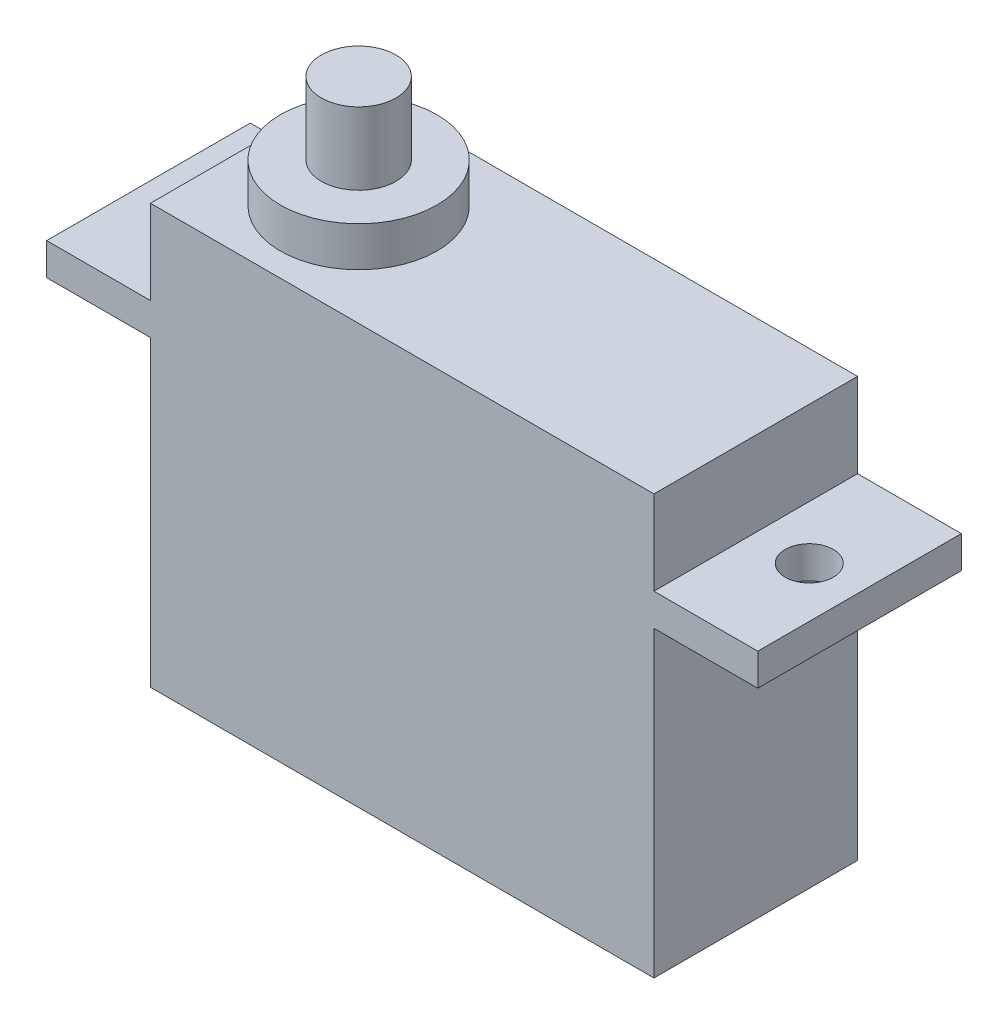
ISO-10303-21;
HEADER;
FILE_DESCRIPTION(('STEP AP214'),'2;1');
FILE_NAME('part.step','',(''),(''),'','','');
FILE_SCHEMA(('AUTOMOTIVE_DESIGN { 1 0 10303 214 1 1 1 1 }'));
ENDSEC;
DATA;
#1=APPLICATION_CONTEXT('core data for automotive mechanical design processes');
#2=APPLICATION_PROTOCOL_DEFINITION('international standard','automotive_design',2000,#1);
#3=PRODUCT_CONTEXT('',#1,'mechanical');
#4=PRODUCT('Part','Part','',(#3));
#5=PRODUCT_RELATED_PRODUCT_CATEGORY('part','',(#4));
#6=PRODUCT_DEFINITION_FORMATION('','',#4);
#7=PRODUCT_DEFINITION_CONTEXT('part definition',#1,'design');
#8=PRODUCT_DEFINITION('design','',#6,#7);
#9=PRODUCT_DEFINITION_SHAPE('','',#8);
#10=(LENGTH_UNIT() NAMED_UNIT(*) SI_UNIT(.MILLI.,.METRE.));
#11=(NAMED_UNIT(*) PLANE_ANGLE_UNIT() SI_UNIT($,.RADIAN.));
#12=(NAMED_UNIT(*) SI_UNIT($,.STERADIAN.) SOLID_ANGLE_UNIT());
#13=UNCERTAINTY_MEASURE_WITH_UNIT(LENGTH_MEASURE(1.E-05),#10,'distance_accuracy_value','');
#14=(GEOMETRIC_REPRESENTATION_CONTEXT(3) GLOBAL_UNCERTAINTY_ASSIGNED_CONTEXT((#13)) GLOBAL_UNIT_ASSIGNED_CONTEXT((#10,
#11,#12)) REPRESENTATION_CONTEXT('',''));
#15=CARTESIAN_POINT('',(0.,0.,0.));
#16=DIRECTION('',(0.,0.,1.));
#17=DIRECTION('',(1.,0.,0.));
#18=AXIS2_PLACEMENT_3D('',#15,#16,#17);
#19=CARTESIAN_POINT('',(-3.88,0.,7.61));
#20=DIRECTION('',(0.,1.,0.));
#21=DIRECTION('',(0.,0.,1.));
#22=AXIS2_PLACEMENT_3D('',#19,#20,#21);
#23=PLANE('',#22);
#24=CARTESIAN_POINT('',(-2.,0.,3.805));
#25=DIRECTION('',(0.,1.,0.));
#26=DIRECTION('',(0.,0.,1.));
#27=AXIS2_PLACEMENT_3D('',#24,#25,#26);
#28=CIRCLE('',#27,0.9);
#29=CARTESIAN_POINT('',(-2.9,0.,3.805));
#30=VERTEX_POINT('',#29);
#31=EDGE_CURVE('E271',#30,#30,#28,.F.);
#32=ORIENTED_EDGE('',*,*,#31,.F.);
#33=EDGE_LOOP('',(#32));
#34=FACE_BOUND('',#33,.T.);
#35=DIRECTION('',(1.,0.,0.));
#36=VECTOR('',#35,1.);
#37=CARTESIAN_POINT('',(-3.88,0.,0.));
#38=LINE('',#37,#36);
#39=CARTESIAN_POINT('',(-3.88,0.,0.));
#40=VERTEX_POINT('',#39);
#41=CARTESIAN_POINT('',(0.,0.,0.));
#42=VERTEX_POINT('',#41);
#43=EDGE_CURVE('E154',#40,#42,#38,.T.);
#44=ORIENTED_EDGE('',*,*,#43,.T.);
#45=DIRECTION('',(0.,0.,-1.));
#46=VECTOR('',#45,1.);
#47=CARTESIAN_POINT('',(0.,0.,7.61));
#48=LINE('',#47,#46);
#49=CARTESIAN_POINT('',(0.,0.,7.61));
#50=VERTEX_POINT('',#49);
#51=EDGE_CURVE('E41',#50,#42,#48,.T.);
#52=ORIENTED_EDGE('',*,*,#51,.F.);
#53=DIRECTION('',(1.,0.,0.));
#54=VECTOR('',#53,1.);
#55=CARTESIAN_POINT('',(-3.88,0.,7.61));
#56=LINE('',#55,#54);
#57=CARTESIAN_POINT('',(-3.88,0.,7.61));
#58=VERTEX_POINT('',#57);
#59=EDGE_CURVE('E177',#58,#50,#56,.T.);
#60=ORIENTED_EDGE('',*,*,#59,.F.);
#61=DIRECTION('',(0.,0.,-1.));
#62=VECTOR('',#61,1.);
#63=CARTESIAN_POINT('',(-3.88,0.,7.61));
#64=LINE('',#63,#62);
#65=EDGE_CURVE('E150',#58,#40,#64,.T.);
#66=ORIENTED_EDGE('',*,*,#65,.T.);
#67=EDGE_LOOP('',(#44,#52,#60,#66));
#68=FACE_BOUND('',#67,.T.);
#69=ADVANCED_FACE('F33',(#34,#68),#23,.F.);
#70=CARTESIAN_POINT('',(0.,0.,7.61));
#71=DIRECTION('',(1.,0.,0.));
#72=DIRECTION('',(0.,1.,0.));
#73=AXIS2_PLACEMENT_3D('',#70,#71,#72);
#74=PLANE('',#73);
#75=DIRECTION('',(0.,-1.,0.));
#76=VECTOR('',#75,1.);
#77=CARTESIAN_POINT('',(0.,0.,0.));
#78=LINE('',#77,#76);
#79=CARTESIAN_POINT('',(0.,-11.32,0.));
#80=VERTEX_POINT('',#79);
#81=EDGE_CURVE('E157',#42,#80,#78,.T.);
#82=ORIENTED_EDGE('',*,*,#81,.T.);
#83=DIRECTION('',(0.,0.,-1.));
#84=VECTOR('',#83,1.);
#85=CARTESIAN_POINT('',(0.,-11.32,7.61));
#86=LINE('',#85,#84);
#87=CARTESIAN_POINT('',(0.,-11.32,7.61));
#88=VERTEX_POINT('',#87);
#89=EDGE_CURVE('E199',#88,#80,#86,.T.);
#90=ORIENTED_EDGE('',*,*,#89,.F.);
#91=DIRECTION('',(0.,-1.,0.));
#92=VECTOR('',#91,1.);
#93=CARTESIAN_POINT('',(0.,0.,7.61));
#94=LINE('',#93,#92);
#95=EDGE_CURVE('E105',#50,#88,#94,.T.);
#96=ORIENTED_EDGE('',*,*,#95,.F.);
#97=ORIENTED_EDGE('',*,*,#51,.T.);
#98=EDGE_LOOP('',(#82,#90,#96,#97));
#99=FACE_BOUND('',#98,.T.);
#100=ADVANCED_FACE('F202',(#99),#74,.F.);
#101=CARTESIAN_POINT('',(0.,-11.32,7.61));
#102=DIRECTION('',(0.,1.,0.));
#103=DIRECTION('',(0.,0.,1.));
#104=AXIS2_PLACEMENT_3D('',#101,#102,#103);
#105=PLANE('',#104);
#106=DIRECTION('',(1.,0.,0.));
#107=VECTOR('',#106,1.);
#108=CARTESIAN_POINT('',(0.,-11.32,0.));
#109=LINE('',#108,#107);
#110=CARTESIAN_POINT('',(18.82,-11.32,0.));
#111=VERTEX_POINT('',#110);
#112=EDGE_CURVE('E160',#80,#111,#109,.T.);
#113=ORIENTED_EDGE('',*,*,#112,.T.);
#114=DIRECTION('',(0.,0.,-1.));
#115=VECTOR('',#114,1.);
#116=CARTESIAN_POINT('',(18.82,-11.32,7.61));
#117=LINE('',#116,#115);
#118=CARTESIAN_POINT('',(18.82,-11.32,7.61));
#119=VERTEX_POINT('',#118);
#120=EDGE_CURVE('E196',#119,#111,#117,.T.);
#121=ORIENTED_EDGE('',*,*,#120,.F.);
#122=DIRECTION('',(1.,0.,0.));
#123=VECTOR('',#122,1.);
#124=CARTESIAN_POINT('',(0.,-11.32,7.61));
#125=LINE('',#124,#123);
#126=EDGE_CURVE('E222',#88,#119,#125,.T.);
#127=ORIENTED_EDGE('',*,*,#126,.F.);
#128=ORIENTED_EDGE('',*,*,#89,.T.);
#129=EDGE_LOOP('',(#113,#121,#127,#128));
#130=FACE_BOUND('',#129,.T.);
#131=ADVANCED_FACE('F213',(#130),#105,.F.);
#132=CARTESIAN_POINT('',(18.82,-11.32,7.61));
#133=DIRECTION('',(-1.,0.,0.));
#134=DIRECTION('',(0.,0.,1.));
#135=AXIS2_PLACEMENT_3D('',#132,#133,#134);
#136=PLANE('',#135);
#137=DIRECTION('',(0.,1.,0.));
#138=VECTOR('',#137,1.);
#139=CARTESIAN_POINT('',(18.82,-11.32,0.));
#140=LINE('',#139,#138);
#141=CARTESIAN_POINT('',(18.82,0.,0.));
#142=VERTEX_POINT('',#141);
#143=EDGE_CURVE('E162',#111,#142,#140,.T.);
#144=ORIENTED_EDGE('',*,*,#143,.T.);
#145=DIRECTION('',(0.,0.,-1.));
#146=VECTOR('',#145,1.);
#147=CARTESIAN_POINT('',(18.82,0.,7.61));
#148=LINE('',#147,#146);
#149=CARTESIAN_POINT('',(18.82,0.,7.61));
#150=VERTEX_POINT('',#149);
#151=EDGE_CURVE('E193',#150,#142,#148,.T.);
#152=ORIENTED_EDGE('',*,*,#151,.F.);
#153=DIRECTION('',(0.,1.,0.));
#154=VECTOR('',#153,1.);
#155=CARTESIAN_POINT('',(18.82,-11.32,7.61));
#156=LINE('',#155,#154);
#157=EDGE_CURVE('E219',#119,#150,#156,.T.);
#158=ORIENTED_EDGE('',*,*,#157,.F.);
#159=ORIENTED_EDGE('',*,*,#120,.T.);
#160=EDGE_LOOP('',(#144,#152,#158,#159));
#161=FACE_BOUND('',#160,.T.);
#162=ADVANCED_FACE('F217',(#161),#136,.F.);
#163=CARTESIAN_POINT('',(18.82,0.,7.61));
#164=DIRECTION('',(0.,1.,0.));
#165=DIRECTION('',(0.,0.,1.));
#166=AXIS2_PLACEMENT_3D('',#163,#164,#165);
#167=PLANE('',#166);
#168=CARTESIAN_POINT('',(20.82,0.,3.805));
#169=DIRECTION('',(0.,1.,0.));
#170=DIRECTION('',(0.,0.,1.));
#171=AXIS2_PLACEMENT_3D('',#168,#169,#170);
#172=CIRCLE('',#171,0.9);
#173=CARTESIAN_POINT('',(19.92,0.,3.805));
#174=VERTEX_POINT('',#173);
#175=EDGE_CURVE('E158',#174,#174,#172,.F.);
#176=ORIENTED_EDGE('',*,*,#175,.F.);
#177=EDGE_LOOP('',(#176));
#178=FACE_BOUND('',#177,.T.);
#179=DIRECTION('',(1.,0.,0.));
#180=VECTOR('',#179,1.);
#181=CARTESIAN_POINT('',(18.82,0.,0.));
#182=LINE('',#181,#180);
#183=CARTESIAN_POINT('',(22.7,0.,0.));
#184=VERTEX_POINT('',#183);
#185=EDGE_CURVE('E164',#142,#184,#182,.T.);
#186=ORIENTED_EDGE('',*,*,#185,.T.);
#187=DIRECTION('',(0.,0.,-1.));
#188=VECTOR('',#187,1.);
#189=CARTESIAN_POINT('',(22.7,0.,7.61));
#190=LINE('',#189,#188);
#191=CARTESIAN_POINT('',(22.7,0.,7.61));
#192=VERTEX_POINT('',#191);
#193=EDGE_CURVE('E190',#192,#184,#190,.T.);
#194=ORIENTED_EDGE('',*,*,#193,.F.);
#195=DIRECTION('',(1.,0.,0.));
#196=VECTOR('',#195,1.);
#197=CARTESIAN_POINT('',(18.82,0.,7.61));
#198=LINE('',#197,#196);
#199=EDGE_CURVE('E221',#150,#192,#198,.T.);
#200=ORIENTED_EDGE('',*,*,#199,.F.);
#201=ORIENTED_EDGE('',*,*,#151,.T.);
#202=EDGE_LOOP('',(#186,#194,#200,#201));
#203=FACE_BOUND('',#202,.T.);
#204=ADVANCED_FACE('F253',(#178,#203),#167,.F.);
#205=CARTESIAN_POINT('',(22.7,0.,7.61));
#206=DIRECTION('',(-1.,0.,0.));
#207=DIRECTION('',(0.,0.,1.));
#208=AXIS2_PLACEMENT_3D('',#205,#206,#207);
#209=PLANE('',#208);
#210=DIRECTION('',(0.,1.,0.));
#211=VECTOR('',#210,1.);
#212=CARTESIAN_POINT('',(22.7,0.,0.));
#213=LINE('',#212,#211);
#214=CARTESIAN_POINT('',(22.7,1.2,0.));
#215=VERTEX_POINT('',#214);
#216=EDGE_CURVE('E166',#184,#215,#213,.T.);
#217=ORIENTED_EDGE('',*,*,#216,.T.);
#218=DIRECTION('',(0.,0.,-1.));
#219=VECTOR('',#218,1.);
#220=CARTESIAN_POINT('',(22.7,1.2,7.61));
#221=LINE('',#220,#219);
#222=CARTESIAN_POINT('',(22.7,1.2,7.61));
#223=VERTEX_POINT('',#222);
#224=EDGE_CURVE('E187',#223,#215,#221,.T.);
#225=ORIENTED_EDGE('',*,*,#224,.F.);
#226=DIRECTION('',(0.,1.,0.));
#227=VECTOR('',#226,1.);
#228=CARTESIAN_POINT('',(22.7,0.,7.61));
#229=LINE('',#228,#227);
#230=EDGE_CURVE('E224',#192,#223,#229,.T.);
#231=ORIENTED_EDGE('',*,*,#230,.F.);
#232=ORIENTED_EDGE('',*,*,#193,.T.);
#233=EDGE_LOOP('',(#217,#225,#231,#232));
#234=FACE_BOUND('',#233,.T.);
#235=ADVANCED_FACE('F250',(#234),#209,.F.);
#236=CARTESIAN_POINT('',(22.7,1.2,7.61));
#237=DIRECTION('',(0.,-1.,0.));
#238=DIRECTION('',(1.,0.,0.));
#239=AXIS2_PLACEMENT_3D('',#236,#237,#238);
#240=PLANE('',#239);
#241=CARTESIAN_POINT('',(20.82,1.2,3.805));
#242=DIRECTION('',(0.,1.,0.));
#243=DIRECTION('',(-1.,0.,0.));
#244=AXIS2_PLACEMENT_3D('',#241,#242,#243);
#245=CIRCLE('',#244,0.9);
#246=CARTESIAN_POINT('',(19.92,1.2,3.805));
#247=VERTEX_POINT('',#246);
#248=EDGE_CURVE('E273',#247,#247,#245,.T.);
#249=ORIENTED_EDGE('',*,*,#248,.F.);
#250=EDGE_LOOP('',(#249));
#251=FACE_BOUND('',#250,.T.);
#252=DIRECTION('',(-1.,0.,0.));
#253=VECTOR('',#252,1.);
#254=CARTESIAN_POINT('',(22.7,1.2,0.));
#255=LINE('',#254,#253);
#256=CARTESIAN_POINT('',(18.82,1.2,0.));
#257=VERTEX_POINT('',#256);
#258=EDGE_CURVE('E168',#215,#257,#255,.T.);
#259=ORIENTED_EDGE('',*,*,#258,.T.);
#260=DIRECTION('',(0.,0.,-1.));
#261=VECTOR('',#260,1.);
#262=CARTESIAN_POINT('',(18.82,1.2,7.61));
#263=LINE('',#262,#261);
#264=CARTESIAN_POINT('',(18.82,1.2,7.61));
#265=VERTEX_POINT('',#264);
#266=EDGE_CURVE('E184',#265,#257,#263,.T.);
#267=ORIENTED_EDGE('',*,*,#266,.F.);
#268=DIRECTION('',(-1.,0.,0.));
#269=VECTOR('',#268,1.);
#270=CARTESIAN_POINT('',(22.7,1.2,7.61));
#271=LINE('',#270,#269);
#272=EDGE_CURVE('E230',#223,#265,#271,.T.);
#273=ORIENTED_EDGE('',*,*,#272,.F.);
#274=ORIENTED_EDGE('',*,*,#224,.T.);
#275=EDGE_LOOP('',(#259,#267,#273,#274));
#276=FACE_BOUND('',#275,.T.);
#277=ADVANCED_FACE('F246',(#251,#276),#240,.F.);
#278=CARTESIAN_POINT('',(18.82,1.2,7.61));
#279=DIRECTION('',(-1.,0.,0.));
#280=DIRECTION('',(0.,0.,1.));
#281=AXIS2_PLACEMENT_3D('',#278,#279,#280);
#282=PLANE('',#281);
#283=DIRECTION('',(0.,1.,0.));
#284=VECTOR('',#283,1.);
#285=CARTESIAN_POINT('',(18.82,1.2,0.));
#286=LINE('',#285,#284);
#287=CARTESIAN_POINT('',(18.82,4.35,0.));
#288=VERTEX_POINT('',#287);
#289=EDGE_CURVE('E170',#257,#288,#286,.T.);
#290=ORIENTED_EDGE('',*,*,#289,.T.);
#291=DIRECTION('',(0.,0.,-1.));
#292=VECTOR('',#291,1.);
#293=CARTESIAN_POINT('',(18.82,4.35,7.61));
#294=LINE('',#293,#292);
#295=CARTESIAN_POINT('',(18.82,4.35,7.61));
#296=VERTEX_POINT('',#295);
#297=EDGE_CURVE('E181',#296,#288,#294,.T.);
#298=ORIENTED_EDGE('',*,*,#297,.F.);
#299=DIRECTION('',(0.,1.,0.));
#300=VECTOR('',#299,1.);
#301=CARTESIAN_POINT('',(18.82,1.2,7.61));
#302=LINE('',#301,#300);
#303=EDGE_CURVE('E232',#265,#296,#302,.T.);
#304=ORIENTED_EDGE('',*,*,#303,.F.);
#305=ORIENTED_EDGE('',*,*,#266,.T.);
#306=EDGE_LOOP('',(#290,#298,#304,#305));
#307=FACE_BOUND('',#306,.T.);
#308=ADVANCED_FACE('F238',(#307),#282,.F.);
#309=CARTESIAN_POINT('',(18.82,4.35,7.61));
#310=DIRECTION('',(0.,-1.,0.));
#311=DIRECTION('',(1.,0.,0.));
#312=AXIS2_PLACEMENT_3D('',#309,#310,#311);
#313=PLANE('',#312);
#314=CARTESIAN_POINT('',(3.97741223923731,4.35,3.805));
#315=DIRECTION('',(0.,-1.,0.));
#316=DIRECTION('',(1.,0.,0.));
#317=AXIS2_PLACEMENT_3D('',#314,#315,#316);
#318=CIRCLE('',#317,2.92604087711728);
#319=CARTESIAN_POINT('',(6.90345311635459,4.35,3.805));
#320=VERTEX_POINT('',#319);
#321=EDGE_CURVE('E11',#320,#320,#318,.F.);
#322=ORIENTED_EDGE('',*,*,#321,.F.);
#323=EDGE_LOOP('',(#322));
#324=FACE_BOUND('',#323,.T.);
#325=DIRECTION('',(-1.,0.,0.));
#326=VECTOR('',#325,1.);
#327=CARTESIAN_POINT('',(18.82,4.35,0.));
#328=LINE('',#327,#326);
#329=CARTESIAN_POINT('',(0.,4.35,0.));
#330=VERTEX_POINT('',#329);
#331=EDGE_CURVE('E172',#288,#330,#328,.T.);
#332=ORIENTED_EDGE('',*,*,#331,.T.);
#333=DIRECTION('',(0.,0.,-1.));
#334=VECTOR('',#333,1.);
#335=CARTESIAN_POINT('',(0.,4.35,7.61));
#336=LINE('',#335,#334);
#337=CARTESIAN_POINT('',(0.,4.35,7.61));
#338=VERTEX_POINT('',#337);
#339=EDGE_CURVE('E145',#338,#330,#336,.T.);
#340=ORIENTED_EDGE('',*,*,#339,.F.);
#341=DIRECTION('',(-1.,0.,0.));
#342=VECTOR('',#341,1.);
#343=CARTESIAN_POINT('',(18.82,4.35,7.61));
#344=LINE('',#343,#342);
#345=EDGE_CURVE('E136',#296,#338,#344,.T.);
#346=ORIENTED_EDGE('',*,*,#345,.F.);
#347=ORIENTED_EDGE('',*,*,#297,.T.);
#348=EDGE_LOOP('',(#332,#340,#346,#347));
#349=FACE_BOUND('',#348,.T.);
#350=ADVANCED_FACE('F242',(#324,#349),#313,.F.);
#351=CARTESIAN_POINT('',(0.,4.35,7.61));
#352=DIRECTION('',(1.,0.,0.));
#353=DIRECTION('',(0.,1.,0.));
#354=AXIS2_PLACEMENT_3D('',#351,#352,#353);
#355=PLANE('',#354);
#356=DIRECTION('',(0.,-1.,0.));
#357=VECTOR('',#356,1.);
#358=CARTESIAN_POINT('',(0.,4.35,0.));
#359=LINE('',#358,#357);
#360=CARTESIAN_POINT('',(0.,1.2,0.));
#361=VERTEX_POINT('',#360);
#362=EDGE_CURVE('E144',#330,#361,#359,.T.);
#363=ORIENTED_EDGE('',*,*,#362,.T.);
#364=DIRECTION('',(0.,0.,-1.));
#365=VECTOR('',#364,1.);
#366=CARTESIAN_POINT('',(0.,1.2,7.61));
#367=LINE('',#366,#365);
#368=CARTESIAN_POINT('',(0.,1.2,7.61));
#369=VERTEX_POINT('',#368);
#370=EDGE_CURVE('E141',#369,#361,#367,.T.);
#371=ORIENTED_EDGE('',*,*,#370,.F.);
#372=DIRECTION('',(0.,-1.,0.));
#373=VECTOR('',#372,1.);
#374=CARTESIAN_POINT('',(0.,4.35,7.61));
#375=LINE('',#374,#373);
#376=EDGE_CURVE('E130',#338,#369,#375,.T.);
#377=ORIENTED_EDGE('',*,*,#376,.F.);
#378=ORIENTED_EDGE('',*,*,#339,.T.);
#379=EDGE_LOOP('',(#363,#371,#377,#378));
#380=FACE_BOUND('',#379,.T.);
#381=ADVANCED_FACE('F142',(#380),#355,.F.);
#382=CARTESIAN_POINT('',(0.,1.2,7.61));
#383=DIRECTION('',(0.,-1.,0.));
#384=DIRECTION('',(1.,0.,0.));
#385=AXIS2_PLACEMENT_3D('',#382,#383,#384);
#386=PLANE('',#385);
#387=CARTESIAN_POINT('',(-2.,1.2,3.805));
#388=DIRECTION('',(0.,1.,0.));
#389=DIRECTION('',(-1.,0.,0.));
#390=AXIS2_PLACEMENT_3D('',#387,#388,#389);
#391=CIRCLE('',#390,0.9);
#392=CARTESIAN_POINT('',(-2.9,1.2,3.805));
#393=VERTEX_POINT('',#392);
#394=EDGE_CURVE('E274',#393,#393,#391,.T.);
#395=ORIENTED_EDGE('',*,*,#394,.F.);
#396=EDGE_LOOP('',(#395));
#397=FACE_BOUND('',#396,.T.);
#398=DIRECTION('',(-1.,0.,0.));
#399=VECTOR('',#398,1.);
#400=CARTESIAN_POINT('',(0.,1.2,0.));
#401=LINE('',#400,#399);
#402=CARTESIAN_POINT('',(-3.88,1.2,0.));
#403=VERTEX_POINT('',#402);
#404=EDGE_CURVE('E90',#361,#403,#401,.T.);
#405=ORIENTED_EDGE('',*,*,#404,.T.);
#406=DIRECTION('',(0.,0.,-1.));
#407=VECTOR('',#406,1.);
#408=CARTESIAN_POINT('',(-3.88,1.2,7.61));
#409=LINE('',#408,#407);
#410=CARTESIAN_POINT('',(-3.88,1.2,7.61));
#411=VERTEX_POINT('',#410);
#412=EDGE_CURVE('E146',#411,#403,#409,.T.);
#413=ORIENTED_EDGE('',*,*,#412,.F.);
#414=DIRECTION('',(-1.,0.,0.));
#415=VECTOR('',#414,1.);
#416=CARTESIAN_POINT('',(0.,1.2,7.61));
#417=LINE('',#416,#415);
#418=EDGE_CURVE('E134',#369,#411,#417,.T.);
#419=ORIENTED_EDGE('',*,*,#418,.F.);
#420=ORIENTED_EDGE('',*,*,#370,.T.);
#421=EDGE_LOOP('',(#405,#413,#419,#420));
#422=FACE_BOUND('',#421,.T.);
#423=ADVANCED_FACE('F148',(#397,#422),#386,.F.);
#424=CARTESIAN_POINT('',(-3.88,1.2,7.61));
#425=DIRECTION('',(1.,0.,0.));
#426=DIRECTION('',(0.,0.,-1.));
#427=AXIS2_PLACEMENT_3D('',#424,#425,#426);
#428=PLANE('',#427);
#429=DIRECTION('',(0.,-1.,0.));
#430=VECTOR('',#429,1.);
#431=CARTESIAN_POINT('',(-3.88,1.2,0.));
#432=LINE('',#431,#430);
#433=EDGE_CURVE('E96',#403,#40,#432,.T.);
#434=ORIENTED_EDGE('',*,*,#433,.T.);
#435=ORIENTED_EDGE('',*,*,#65,.F.);
#436=DIRECTION('',(0.,-1.,0.));
#437=VECTOR('',#436,1.);
#438=CARTESIAN_POINT('',(-3.88,1.2,7.61));
#439=LINE('',#438,#437);
#440=EDGE_CURVE('E49',#411,#58,#439,.T.);
#441=ORIENTED_EDGE('',*,*,#440,.F.);
#442=ORIENTED_EDGE('',*,*,#412,.T.);
#443=EDGE_LOOP('',(#434,#435,#441,#442));
#444=FACE_BOUND('',#443,.T.);
#445=ADVANCED_FACE('F307',(#444),#428,.F.);
#446=CARTESIAN_POINT('',(0.,0.,7.61));
#447=DIRECTION('',(0.,0.,-1.));
#448=DIRECTION('',(-1.,0.,0.));
#449=AXIS2_PLACEMENT_3D('',#446,#447,#448);
#450=PLANE('',#449);
#451=ORIENTED_EDGE('',*,*,#59,.T.);
#452=ORIENTED_EDGE('',*,*,#95,.T.);
#453=ORIENTED_EDGE('',*,*,#126,.T.);
#454=ORIENTED_EDGE('',*,*,#157,.T.);
#455=ORIENTED_EDGE('',*,*,#199,.T.);
#456=ORIENTED_EDGE('',*,*,#230,.T.);
#457=ORIENTED_EDGE('',*,*,#272,.T.);
#458=ORIENTED_EDGE('',*,*,#303,.T.);
#459=ORIENTED_EDGE('',*,*,#345,.T.);
#460=ORIENTED_EDGE('',*,*,#376,.T.);
#461=ORIENTED_EDGE('',*,*,#418,.T.);
#462=ORIENTED_EDGE('',*,*,#440,.T.);
#463=EDGE_LOOP('',(#451,#452,#453,#454,#455,#456,#457,#458,#459,#460,#461,#462));
#464=FACE_BOUND('',#463,.T.);
#465=ADVANCED_FACE('F132',(#464),#450,.F.);
#466=CARTESIAN_POINT('',(0.,0.,0.));
#467=DIRECTION('',(0.,0.,-1.));
#468=DIRECTION('',(-1.,0.,0.));
#469=AXIS2_PLACEMENT_3D('',#466,#467,#468);
#470=PLANE('',#469);
#471=ORIENTED_EDGE('',*,*,#43,.F.);
#472=ORIENTED_EDGE('',*,*,#433,.F.);
#473=ORIENTED_EDGE('',*,*,#404,.F.);
#474=ORIENTED_EDGE('',*,*,#362,.F.);
#475=ORIENTED_EDGE('',*,*,#331,.F.);
#476=ORIENTED_EDGE('',*,*,#289,.F.);
#477=ORIENTED_EDGE('',*,*,#258,.F.);
#478=ORIENTED_EDGE('',*,*,#216,.F.);
#479=ORIENTED_EDGE('',*,*,#185,.F.);
#480=ORIENTED_EDGE('',*,*,#143,.F.);
#481=ORIENTED_EDGE('',*,*,#112,.F.);
#482=ORIENTED_EDGE('',*,*,#81,.F.);
#483=EDGE_LOOP('',(#471,#472,#473,#474,#475,#476,#477,#478,#479,#480,#481,#482));
#484=FACE_BOUND('',#483,.T.);
#485=ADVANCED_FACE('F207',(#484),#470,.T.);
#486=CARTESIAN_POINT('',(20.82,-2.54558441227157,3.805));
#487=DIRECTION('',(0.,1.,0.));
#488=DIRECTION('',(-1.,0.,0.));
#489=AXIS2_PLACEMENT_3D('',#486,#487,#488);
#490=CYLINDRICAL_SURFACE('',#489,0.9);
#491=CARTESIAN_POINT('',(19.92,0.,3.805));
#492=CARTESIAN_POINT('',(19.92,0.0124999999999996,3.805));
#493=CARTESIAN_POINT('',(19.92,0.0249999999999997,3.805));
#494=CARTESIAN_POINT('',(19.92,0.0499999999999997,3.805));
#495=CARTESIAN_POINT('',(19.92,0.0624999999999996,3.805));
#496=CARTESIAN_POINT('',(19.92,0.0874999999999995,3.805));
#497=CARTESIAN_POINT('',(19.92,0.0999999999999994,3.805));
#498=CARTESIAN_POINT('',(19.92,0.124999999999999,3.805));
#499=CARTESIAN_POINT('',(19.92,0.137499999999999,3.805));
#500=CARTESIAN_POINT('',(19.92,0.1625,3.805));
#501=CARTESIAN_POINT('',(19.92,0.175,3.805));
#502=CARTESIAN_POINT('',(19.92,0.2,3.805));
#503=CARTESIAN_POINT('',(19.92,0.2125,3.805));
#504=CARTESIAN_POINT('',(19.92,0.237499999999999,3.805));
#505=CARTESIAN_POINT('',(19.92,0.249999999999999,3.805));
#506=CARTESIAN_POINT('',(19.92,0.274999999999999,3.805));
#507=CARTESIAN_POINT('',(19.92,0.287499999999999,3.805));
#508=CARTESIAN_POINT('',(19.92,0.3125,3.805));
#509=CARTESIAN_POINT('',(19.92,0.325,3.805));
#510=CARTESIAN_POINT('',(19.92,0.35,3.805));
#511=CARTESIAN_POINT('',(19.92,0.3625,3.805));
#512=CARTESIAN_POINT('',(19.92,0.387499999999999,3.805));
#513=CARTESIAN_POINT('',(19.92,0.399999999999999,3.805));
#514=CARTESIAN_POINT('',(19.92,0.424999999999999,3.805));
#515=CARTESIAN_POINT('',(19.92,0.437499999999999,3.805));
#516=CARTESIAN_POINT('',(19.92,0.4625,3.805));
#517=CARTESIAN_POINT('',(19.92,0.475,3.805));
#518=CARTESIAN_POINT('',(19.92,0.5,3.805));
#519=CARTESIAN_POINT('',(19.92,0.5125,3.805));
#520=CARTESIAN_POINT('',(19.92,0.537499999999999,3.805));
#521=CARTESIAN_POINT('',(19.92,0.549999999999999,3.805));
#522=CARTESIAN_POINT('',(19.92,0.574999999999999,3.805));
#523=CARTESIAN_POINT('',(19.92,0.587499999999999,3.805));
#524=CARTESIAN_POINT('',(19.92,0.612499999999999,3.805));
#525=CARTESIAN_POINT('',(19.92,0.625,3.805));
#526=CARTESIAN_POINT('',(19.92,0.65,3.805));
#527=CARTESIAN_POINT('',(19.92,0.662499999999999,3.805));
#528=CARTESIAN_POINT('',(19.92,0.687499999999999,3.805));
#529=CARTESIAN_POINT('',(19.92,0.699999999999999,3.805));
#530=CARTESIAN_POINT('',(19.92,0.724999999999999,3.805));
#531=CARTESIAN_POINT('',(19.92,0.737499999999999,3.805));
#532=CARTESIAN_POINT('',(19.92,0.762499999999999,3.805));
#533=CARTESIAN_POINT('',(19.92,0.775,3.805));
#534=CARTESIAN_POINT('',(19.92,0.799999999999999,3.805));
#535=CARTESIAN_POINT('',(19.92,0.812499999999999,3.805));
#536=CARTESIAN_POINT('',(19.92,0.837499999999999,3.805));
#537=CARTESIAN_POINT('',(19.92,0.849999999999999,3.805));
#538=CARTESIAN_POINT('',(19.92,0.874999999999999,3.805));
#539=CARTESIAN_POINT('',(19.92,0.887499999999999,3.805));
#540=CARTESIAN_POINT('',(19.92,0.912499999999999,3.805));
#541=CARTESIAN_POINT('',(19.92,0.924999999999999,3.805));
#542=CARTESIAN_POINT('',(19.92,0.95,3.805));
#543=CARTESIAN_POINT('',(19.92,0.962499999999999,3.805));
#544=CARTESIAN_POINT('',(19.92,0.987499999999999,3.805));
#545=CARTESIAN_POINT('',(19.92,0.999999999999999,3.805));
#546=CARTESIAN_POINT('',(19.92,1.025,3.805));
#547=CARTESIAN_POINT('',(19.92,1.0375,3.805));
#548=CARTESIAN_POINT('',(19.92,1.0625,3.805));
#549=CARTESIAN_POINT('',(19.92,1.075,3.805));
#550=CARTESIAN_POINT('',(19.92,1.1,3.805));
#551=CARTESIAN_POINT('',(19.92,1.1125,3.805));
#552=CARTESIAN_POINT('',(19.92,1.1375,3.805));
#553=CARTESIAN_POINT('',(19.92,1.15,3.805));
#554=CARTESIAN_POINT('',(19.92,1.175,3.805));
#555=CARTESIAN_POINT('',(19.92,1.1875,3.805));
#556=CARTESIAN_POINT('',(19.92,1.2,3.805));
#557=B_SPLINE_CURVE_WITH_KNOTS('',3,(#491,#492,#493,#494,#495,#496,#497,#498,#499,#500,#501,
#502,#503,#504,#505,#506,#507,#508,#509,#510,#511,#512,#513,#514,#515,#516,#517,#518,#519,#520,
#521,#522,#523,#524,#525,#526,#527,#528,#529,#530,#531,#532,#533,#534,#535,#536,#537,#538,#539,
#540,#541,#542,#543,#544,#545,#546,#547,#548,#549,#550,#551,#552,#553,#554,#555,#556),
.UNSPECIFIED.,.F.,.F.,(4,2,2,2,2,2,2,2,2,2,2,2,2,2,2,2,2,2,2,2,2,2,2,2,2,2,2,2,2,2,2,2,4),(0.,
0.0375000000000002,0.075,0.1125,0.15,0.1875,0.225,0.2625,0.3,0.3375,0.375,0.4125,0.45,0.4875,
0.525,0.5625,0.6,0.6375,0.675,0.7125,0.75,0.7875,0.825,0.8625,0.9,0.9375,0.975,1.0125,1.05,
1.0875,1.125,1.1625,1.2),.UNSPECIFIED.);
#558=EDGE_CURVE('BSEAM286',#174,#247,#557,.T.);
#559=ORIENTED_EDGE('',*,*,#175,.T.);
#560=ORIENTED_EDGE('',*,*,#248,.T.);
#561=ORIENTED_EDGE('',*,*,#558,.T.);
#562=ORIENTED_EDGE('',*,*,#558,.F.);
#563=EDGE_LOOP('',(#559,#561,#560,#562));
#564=FACE_BOUND('',#563,.T.);
#565=ADVANCED_FACE('F286',(#564),#490,.F.);
#566=CARTESIAN_POINT('',(-2.,-2.54558441227158,3.805));
#567=DIRECTION('',(0.,1.,0.));
#568=DIRECTION('',(-1.,0.,0.));
#569=AXIS2_PLACEMENT_3D('',#566,#567,#568);
#570=CYLINDRICAL_SURFACE('',#569,0.9);
#571=CARTESIAN_POINT('',(-2.9,0.,3.805));
#572=CARTESIAN_POINT('',(-2.9,0.0124999999999995,3.805));
#573=CARTESIAN_POINT('',(-2.9,0.0249999999999994,3.805));
#574=CARTESIAN_POINT('',(-2.9,0.0499999999999994,3.805));
#575=CARTESIAN_POINT('',(-2.9,0.0624999999999995,3.805));
#576=CARTESIAN_POINT('',(-2.9,0.0874999999999995,3.805));
#577=CARTESIAN_POINT('',(-2.9,0.0999999999999994,3.805));
#578=CARTESIAN_POINT('',(-2.9,0.124999999999999,3.805));
#579=CARTESIAN_POINT('',(-2.9,0.137499999999999,3.805));
#580=CARTESIAN_POINT('',(-2.9,0.162499999999999,3.805));
#581=CARTESIAN_POINT('',(-2.9,0.174999999999999,3.805));
#582=CARTESIAN_POINT('',(-2.9,0.199999999999999,3.805));
#583=CARTESIAN_POINT('',(-2.9,0.212499999999999,3.805));
#584=CARTESIAN_POINT('',(-2.9,0.237499999999999,3.805));
#585=CARTESIAN_POINT('',(-2.9,0.249999999999999,3.805));
#586=CARTESIAN_POINT('',(-2.9,0.274999999999999,3.805));
#587=CARTESIAN_POINT('',(-2.9,0.287499999999999,3.805));
#588=CARTESIAN_POINT('',(-2.9,0.312499999999999,3.805));
#589=CARTESIAN_POINT('',(-2.9,0.324999999999999,3.805));
#590=CARTESIAN_POINT('',(-2.9,0.349999999999999,3.805));
#591=CARTESIAN_POINT('',(-2.9,0.362499999999999,3.805));
#592=CARTESIAN_POINT('',(-2.9,0.387499999999999,3.805));
#593=CARTESIAN_POINT('',(-2.9,0.399999999999998,3.805));
#594=CARTESIAN_POINT('',(-2.9,0.424999999999998,3.805));
#595=CARTESIAN_POINT('',(-2.9,0.437499999999999,3.805));
#596=CARTESIAN_POINT('',(-2.9,0.462499999999999,3.805));
#597=CARTESIAN_POINT('',(-2.9,0.474999999999998,3.805));
#598=CARTESIAN_POINT('',(-2.9,0.499999999999998,3.805));
#599=CARTESIAN_POINT('',(-2.9,0.512499999999998,3.805));
#600=CARTESIAN_POINT('',(-2.9,0.537499999999998,3.805));
#601=CARTESIAN_POINT('',(-2.9,0.549999999999998,3.805));
#602=CARTESIAN_POINT('',(-2.9,0.574999999999998,3.805));
#603=CARTESIAN_POINT('',(-2.9,0.587499999999998,3.805));
#604=CARTESIAN_POINT('',(-2.9,0.612499999999998,3.805));
#605=CARTESIAN_POINT('',(-2.9,0.624999999999998,3.805));
#606=CARTESIAN_POINT('',(-2.9,0.649999999999998,3.805));
#607=CARTESIAN_POINT('',(-2.9,0.662499999999998,3.805));
#608=CARTESIAN_POINT('',(-2.9,0.687499999999998,3.805));
#609=CARTESIAN_POINT('',(-2.9,0.699999999999998,3.805));
#610=CARTESIAN_POINT('',(-2.9,0.724999999999998,3.805));
#611=CARTESIAN_POINT('',(-2.9,0.737499999999998,3.805));
#612=CARTESIAN_POINT('',(-2.9,0.762499999999998,3.805));
#613=CARTESIAN_POINT('',(-2.9,0.774999999999998,3.805));
#614=CARTESIAN_POINT('',(-2.9,0.799999999999998,3.805));
#615=CARTESIAN_POINT('',(-2.9,0.812499999999998,3.805));
#616=CARTESIAN_POINT('',(-2.9,0.837499999999998,3.805));
#617=CARTESIAN_POINT('',(-2.9,0.849999999999997,3.805));
#618=CARTESIAN_POINT('',(-2.9,0.874999999999997,3.805));
#619=CARTESIAN_POINT('',(-2.9,0.887499999999998,3.805));
#620=CARTESIAN_POINT('',(-2.9,0.912499999999998,3.805));
#621=CARTESIAN_POINT('',(-2.9,0.924999999999997,3.805));
#622=CARTESIAN_POINT('',(-2.9,0.949999999999997,3.805));
#623=CARTESIAN_POINT('',(-2.9,0.962499999999997,3.805));
#624=CARTESIAN_POINT('',(-2.9,0.987499999999997,3.805));
#625=CARTESIAN_POINT('',(-2.9,0.999999999999997,3.805));
#626=CARTESIAN_POINT('',(-2.9,1.025,3.805));
#627=CARTESIAN_POINT('',(-2.9,1.0375,3.805));
#628=CARTESIAN_POINT('',(-2.9,1.0625,3.805));
#629=CARTESIAN_POINT('',(-2.9,1.075,3.805));
#630=CARTESIAN_POINT('',(-2.9,1.1,3.805));
#631=CARTESIAN_POINT('',(-2.9,1.1125,3.805));
#632=CARTESIAN_POINT('',(-2.9,1.1375,3.805));
#633=CARTESIAN_POINT('',(-2.9,1.15,3.805));
#634=CARTESIAN_POINT('',(-2.9,1.175,3.805));
#635=CARTESIAN_POINT('',(-2.9,1.1875,3.805));
#636=CARTESIAN_POINT('',(-2.9,1.2,3.805));
#637=B_SPLINE_CURVE_WITH_KNOTS('',3,(#571,#572,#573,#574,#575,#576,#577,#578,#579,#580,#581,
#582,#583,#584,#585,#586,#587,#588,#589,#590,#591,#592,#593,#594,#595,#596,#597,#598,#599,#600,
#601,#602,#603,#604,#605,#606,#607,#608,#609,#610,#611,#612,#613,#614,#615,#616,#617,#618,#619,
#620,#621,#622,#623,#624,#625,#626,#627,#628,#629,#630,#631,#632,#633,#634,#635,#636),
.UNSPECIFIED.,.F.,.F.,(4,2,2,2,2,2,2,2,2,2,2,2,2,2,2,2,2,2,2,2,2,2,2,2,2,2,2,2,2,2,2,2,4),(0.,
0.0374999999999998,0.075,0.1125,0.15,0.1875,0.225,0.262499999999999,0.299999999999999,
0.337499999999999,0.374999999999999,0.412499999999999,0.449999999999999,0.487499999999999,
0.524999999999999,0.562499999999999,0.599999999999999,0.637499999999998,0.674999999999998,
0.712499999999998,0.749999999999998,0.787499999999998,0.824999999999998,0.862499999999998,
0.899999999999998,0.937499999999998,0.974999999999998,1.0125,1.05,1.0875,1.125,1.1625,1.2),.UNSPECIFIED.);
#638=EDGE_CURVE('BSEAM289',#30,#393,#637,.T.);
#639=ORIENTED_EDGE('',*,*,#31,.T.);
#640=ORIENTED_EDGE('',*,*,#394,.T.);
#641=ORIENTED_EDGE('',*,*,#638,.T.);
#642=ORIENTED_EDGE('',*,*,#638,.F.);
#643=EDGE_LOOP('',(#639,#641,#640,#642));
#644=FACE_BOUND('',#643,.T.);
#645=ADVANCED_FACE('F289',(#644),#570,.F.);
#646=CARTESIAN_POINT('',(3.97741223923731,5.84,3.805));
#647=DIRECTION('',(0.,-1.,0.));
#648=DIRECTION('',(1.,0.,0.));
#649=AXIS2_PLACEMENT_3D('',#646,#647,#648);
#650=CYLINDRICAL_SURFACE('',#649,2.92604087711728);
#651=CARTESIAN_POINT('',(3.97741223923731,5.84,3.805));
#652=DIRECTION('',(0.,1.,0.));
#653=DIRECTION('',(-1.,0.,0.));
#654=AXIS2_PLACEMENT_3D('',#651,#652,#653);
#655=CIRCLE('',#654,2.92604087711728);
#656=CARTESIAN_POINT('',(1.05137136212003,5.84,3.805));
#657=VERTEX_POINT('',#656);
#658=EDGE_CURVE('E279',#657,#657,#655,.T.);
#659=ORIENTED_EDGE('',*,*,#658,.F.);
#660=EDGE_LOOP('',(#659));
#661=FACE_BOUND('',#660,.T.);
#662=ORIENTED_EDGE('',*,*,#321,.T.);
#663=EDGE_LOOP('',(#662));
#664=FACE_BOUND('',#663,.T.);
#665=ADVANCED_FACE('F317',(#661,#664),#650,.T.);
#666=CARTESIAN_POINT('',(3.97741223923731,5.84,3.805));
#667=DIRECTION('',(0.,1.,0.));
#668=DIRECTION('',(-1.,0.,0.));
#669=AXIS2_PLACEMENT_3D('',#666,#667,#668);
#670=PLANE('',#669);
#671=CARTESIAN_POINT('',(3.97741223923731,5.84,3.805));
#672=DIRECTION('',(0.,1.,0.));
#673=DIRECTION('',(-1.,0.,0.));
#674=AXIS2_PLACEMENT_3D('',#671,#672,#673);
#675=CIRCLE('',#674,1.3938543020483);
#676=CARTESIAN_POINT('',(5.37126654128561,5.84,3.805));
#677=VERTEX_POINT('',#676);
#678=EDGE_CURVE('E337',#677,#677,#675,.T.);
#679=ORIENTED_EDGE('',*,*,#678,.F.);
#680=EDGE_LOOP('',(#679));
#681=FACE_BOUND('',#680,.T.);
#682=ORIENTED_EDGE('',*,*,#658,.T.);
#683=EDGE_LOOP('',(#682));
#684=FACE_BOUND('',#683,.T.);
#685=ADVANCED_FACE('F320',(#681,#684),#670,.T.);
#686=CARTESIAN_POINT('',(3.97741223923731,8.54,3.805));
#687=DIRECTION('',(0.,-1.,0.));
#688=DIRECTION('',(1.,0.,0.));
#689=AXIS2_PLACEMENT_3D('',#686,#687,#688);
#690=CYLINDRICAL_SURFACE('',#689,1.3938543020483);
#691=CARTESIAN_POINT('',(3.97741223923731,8.54,3.805));
#692=DIRECTION('',(0.,1.,0.));
#693=DIRECTION('',(-1.,0.,0.));
#694=AXIS2_PLACEMENT_3D('',#691,#692,#693);
#695=CIRCLE('',#694,1.3938543020483);
#696=CARTESIAN_POINT('',(5.37126654128561,8.54,3.805));
#697=VERTEX_POINT('',#696);
#698=EDGE_CURVE('E336',#697,#697,#695,.T.);
#699=CARTESIAN_POINT('',(5.37126654128561,8.54,3.805));
#700=CARTESIAN_POINT('',(5.37126654128561,8.511875,3.805));
#701=CARTESIAN_POINT('',(5.37126654128561,8.48375,3.805));
#702=CARTESIAN_POINT('',(5.37126654128561,8.4275,3.805));
#703=CARTESIAN_POINT('',(5.37126654128561,8.399375,3.805));
#704=CARTESIAN_POINT('',(5.37126654128561,8.343125,3.805));
#705=CARTESIAN_POINT('',(5.37126654128561,8.315,3.805));
#706=CARTESIAN_POINT('',(5.37126654128561,8.25875,3.805));
#707=CARTESIAN_POINT('',(5.37126654128561,8.230625,3.805));
#708=CARTESIAN_POINT('',(5.37126654128561,8.174375,3.805));
#709=CARTESIAN_POINT('',(5.37126654128561,8.14625,3.805));
#710=CARTESIAN_POINT('',(5.37126654128561,8.09,3.805));
#711=CARTESIAN_POINT('',(5.37126654128561,8.061875,3.805));
#712=CARTESIAN_POINT('',(5.37126654128561,8.005625,3.805));
#713=CARTESIAN_POINT('',(5.37126654128561,7.9775,3.805));
#714=CARTESIAN_POINT('',(5.37126654128561,7.92125,3.805));
#715=CARTESIAN_POINT('',(5.37126654128561,7.893125,3.805));
#716=CARTESIAN_POINT('',(5.37126654128561,7.836875,3.805));
#717=CARTESIAN_POINT('',(5.37126654128561,7.80875,3.805));
#718=CARTESIAN_POINT('',(5.37126654128561,7.7525,3.805));
#719=CARTESIAN_POINT('',(5.37126654128561,7.724375,3.805));
#720=CARTESIAN_POINT('',(5.37126654128561,7.668125,3.805));
#721=CARTESIAN_POINT('',(5.37126654128561,7.64,3.805));
#722=CARTESIAN_POINT('',(5.37126654128561,7.58375,3.805));
#723=CARTESIAN_POINT('',(5.37126654128561,7.555625,3.805));
#724=CARTESIAN_POINT('',(5.37126654128561,7.499375,3.805));
#725=CARTESIAN_POINT('',(5.37126654128561,7.47125,3.805));
#726=CARTESIAN_POINT('',(5.37126654128561,7.415,3.805));
#727=CARTESIAN_POINT('',(5.37126654128561,7.386875,3.805));
#728=CARTESIAN_POINT('',(5.37126654128561,7.330625,3.805));
#729=CARTESIAN_POINT('',(5.37126654128561,7.3025,3.805));
#730=CARTESIAN_POINT('',(5.37126654128561,7.24625,3.805));
#731=CARTESIAN_POINT('',(5.37126654128561,7.218125,3.805));
#732=CARTESIAN_POINT('',(5.37126654128561,7.161875,3.805));
#733=CARTESIAN_POINT('',(5.37126654128561,7.13375,3.805));
#734=CARTESIAN_POINT('',(5.37126654128561,7.0775,3.805));
#735=CARTESIAN_POINT('',(5.37126654128561,7.049375,3.805));
#736=CARTESIAN_POINT('',(5.37126654128561,6.993125,3.805));
#737=CARTESIAN_POINT('',(5.37126654128561,6.965,3.805));
#738=CARTESIAN_POINT('',(5.37126654128561,6.90875,3.805));
#739=CARTESIAN_POINT('',(5.37126654128561,6.880625,3.805));
#740=CARTESIAN_POINT('',(5.37126654128561,6.824375,3.805));
#741=CARTESIAN_POINT('',(5.37126654128561,6.79625,3.805));
#742=CARTESIAN_POINT('',(5.37126654128561,6.74,3.805));
#743=CARTESIAN_POINT('',(5.37126654128561,6.711875,3.805));
#744=CARTESIAN_POINT('',(5.37126654128561,6.655625,3.805));
#745=CARTESIAN_POINT('',(5.37126654128561,6.6275,3.805));
#746=CARTESIAN_POINT('',(5.37126654128561,6.57125,3.805));
#747=CARTESIAN_POINT('',(5.37126654128561,6.543125,3.805));
#748=CARTESIAN_POINT('',(5.37126654128561,6.486875,3.805));
#749=CARTESIAN_POINT('',(5.37126654128561,6.45875,3.805));
#750=CARTESIAN_POINT('',(5.37126654128561,6.4025,3.805));
#751=CARTESIAN_POINT('',(5.37126654128561,6.374375,3.805));
#752=CARTESIAN_POINT('',(5.37126654128561,6.318125,3.805));
#753=CARTESIAN_POINT('',(5.37126654128561,6.29,3.805));
#754=CARTESIAN_POINT('',(5.37126654128561,6.23375,3.805));
#755=CARTESIAN_POINT('',(5.37126654128561,6.205625,3.805));
#756=CARTESIAN_POINT('',(5.37126654128561,6.149375,3.805));
#757=CARTESIAN_POINT('',(5.37126654128561,6.12125,3.805));
#758=CARTESIAN_POINT('',(5.37126654128561,6.065,3.805));
#759=CARTESIAN_POINT('',(5.37126654128561,6.036875,3.805));
#760=CARTESIAN_POINT('',(5.37126654128561,5.980625,3.805));
#761=CARTESIAN_POINT('',(5.37126654128561,5.9525,3.805));
#762=CARTESIAN_POINT('',(5.37126654128561,5.89625,3.805));
#763=CARTESIAN_POINT('',(5.37126654128561,5.868125,3.805));
#764=CARTESIAN_POINT('',(5.37126654128561,5.84,3.805));
#765=B_SPLINE_CURVE_WITH_KNOTS('',3,(#699,#700,#701,#702,#703,#704,#705,#706,#707,#708,#709,
#710,#711,#712,#713,#714,#715,#716,#717,#718,#719,#720,#721,#722,#723,#724,#725,#726,#727,#728,
#729,#730,#731,#732,#733,#734,#735,#736,#737,#738,#739,#740,#741,#742,#743,#744,#745,#746,#747,
#748,#749,#750,#751,#752,#753,#754,#755,#756,#757,#758,#759,#760,#761,#762,#763,#764),
.UNSPECIFIED.,.F.,.F.,(4,2,2,2,2,2,2,2,2,2,2,2,2,2,2,2,2,2,2,2,2,2,2,2,2,2,2,2,2,2,2,2,4),(0.,
0.0843750000000011,0.168750000000001,0.253125000000002,0.337500000000001,0.421875,
0.506250000000002,0.590625000000001,0.675,0.759375,0.843750000000001,0.928125000000001,1.0125,
1.096875,1.18125,1.265625,1.35,1.434375,1.51875,1.603125,1.6875,1.771875,1.85625,1.940625,2.025,
2.109375,2.19375,2.278125,2.3625,2.446875,2.53125,2.615625,2.7),.UNSPECIFIED.);
#766=EDGE_CURVE('BSEAM324',#697,#677,#765,.T.);
#767=ORIENTED_EDGE('',*,*,#698,.F.);
#768=ORIENTED_EDGE('',*,*,#678,.T.);
#769=ORIENTED_EDGE('',*,*,#766,.T.);
#770=ORIENTED_EDGE('',*,*,#766,.F.);
#771=EDGE_LOOP('',(#767,#769,#768,#770));
#772=FACE_BOUND('',#771,.T.);
#773=ADVANCED_FACE('F324',(#772),#690,.T.);
#774=CARTESIAN_POINT('',(3.97741223923731,8.54,3.805));
#775=DIRECTION('',(0.,1.,0.));
#776=DIRECTION('',(-1.,0.,0.));
#777=AXIS2_PLACEMENT_3D('',#774,#775,#776);
#778=PLANE('',#777);
#779=ORIENTED_EDGE('',*,*,#698,.T.);
#780=EDGE_LOOP('',(#779));
#781=FACE_BOUND('',#780,.T.);
#782=ADVANCED_FACE('F328',(#781),#778,.T.);
#783=CLOSED_SHELL('',(#69,#100,#131,#162,#204,#235,#277,#308,#350,#381,#423,#445,#465,#485,#565,
#645,#665,#685,#773,#782));
#784=MANIFOLD_SOLID_BREP('B2',#783);
#785=ADVANCED_BREP_SHAPE_REPRESENTATION('',(#18,#784),#14);
#786=SHAPE_DEFINITION_REPRESENTATION(#9,#785);
ENDSEC;
END-ISO-10303-21;
